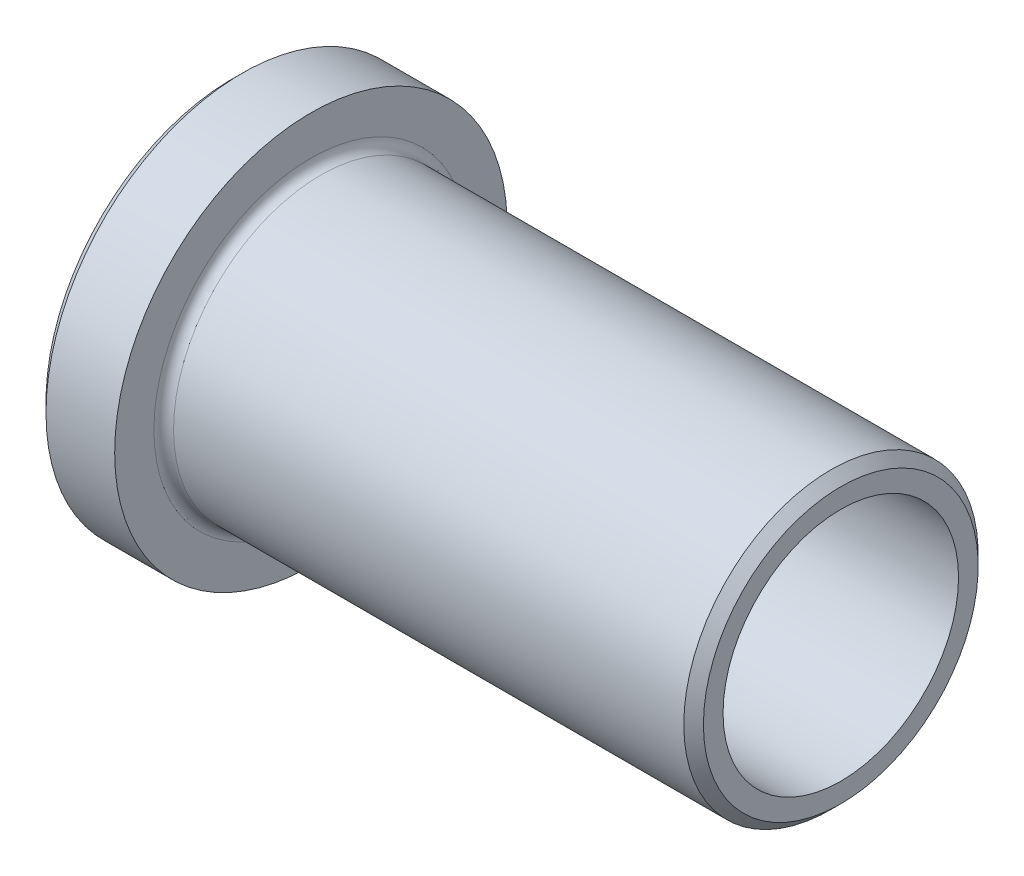
ISO-10303-21;
HEADER;
FILE_DESCRIPTION(('STEP AP214'),'2;1');
FILE_NAME('part.step','',(''),(''),'','','');
FILE_SCHEMA(('AUTOMOTIVE_DESIGN { 1 0 10303 214 1 1 1 1 }'));
ENDSEC;
DATA;
#1=APPLICATION_CONTEXT('core data for automotive mechanical design processes');
#2=APPLICATION_PROTOCOL_DEFINITION('international standard','automotive_design',2000,#1);
#3=PRODUCT_CONTEXT('',#1,'mechanical');
#4=PRODUCT('Part','Part','',(#3));
#5=PRODUCT_RELATED_PRODUCT_CATEGORY('part','',(#4));
#6=PRODUCT_DEFINITION_FORMATION('','',#4);
#7=PRODUCT_DEFINITION_CONTEXT('part definition',#1,'design');
#8=PRODUCT_DEFINITION('design','',#6,#7);
#9=PRODUCT_DEFINITION_SHAPE('','',#8);
#10=(LENGTH_UNIT() NAMED_UNIT(*) SI_UNIT(.MILLI.,.METRE.));
#11=(NAMED_UNIT(*) PLANE_ANGLE_UNIT() SI_UNIT($,.RADIAN.));
#12=(NAMED_UNIT(*) SI_UNIT($,.STERADIAN.) SOLID_ANGLE_UNIT());
#13=UNCERTAINTY_MEASURE_WITH_UNIT(LENGTH_MEASURE(1.E-05),#10,'distance_accuracy_value','');
#14=(GEOMETRIC_REPRESENTATION_CONTEXT(3) GLOBAL_UNCERTAINTY_ASSIGNED_CONTEXT((#13)) GLOBAL_UNIT_ASSIGNED_CONTEXT((#10,
#11,#12)) REPRESENTATION_CONTEXT('',''));
#15=CARTESIAN_POINT('',(0.,0.,0.));
#16=DIRECTION('',(0.,0.,1.));
#17=DIRECTION('',(1.,0.,0.));
#18=AXIS2_PLACEMENT_3D('',#15,#16,#17);
#19=CARTESIAN_POINT('',(-6.11439842209073,0.,0.));
#20=DIRECTION('',(-1.,0.,0.));
#21=DIRECTION('',(0.,0.,1.));
#22=AXIS2_PLACEMENT_3D('',#19,#20,#21);
#23=CYLINDRICAL_SURFACE('',#22,6.);
#24=CARTESIAN_POINT('',(31.,0.,0.));
#25=DIRECTION('',(-1.,0.,0.));
#26=DIRECTION('',(0.,0.,1.));
#27=AXIS2_PLACEMENT_3D('',#24,#25,#26);
#28=CIRCLE('',#27,6.);
#29=CARTESIAN_POINT('',(31.,0.,6.));
#30=VERTEX_POINT('',#29);
#31=EDGE_CURVE('E75',#30,#30,#28,.T.);
#32=ORIENTED_EDGE('',*,*,#31,.F.);
#33=EDGE_LOOP('',(#32));
#34=FACE_BOUND('',#33,.T.);
#35=CARTESIAN_POINT('',(0.,0.,0.));
#36=DIRECTION('',(-1.,0.,0.));
#37=DIRECTION('',(0.,0.,1.));
#38=AXIS2_PLACEMENT_3D('',#35,#36,#37);
#39=CIRCLE('',#38,6.);
#40=CARTESIAN_POINT('',(0.,0.,6.));
#41=VERTEX_POINT('',#40);
#42=EDGE_CURVE('E67',#41,#41,#39,.T.);
#43=ORIENTED_EDGE('',*,*,#42,.T.);
#44=EDGE_LOOP('',(#43));
#45=FACE_BOUND('',#44,.T.);
#46=ADVANCED_FACE('F39',(#34,#45),#23,.F.);
#47=CARTESIAN_POINT('',(0.,6.,0.));
#48=DIRECTION('',(1.,0.,0.));
#49=DIRECTION('',(0.,0.,-1.));
#50=AXIS2_PLACEMENT_3D('',#47,#48,#49);
#51=PLANE('',#50);
#52=CARTESIAN_POINT('',(0.,0.,0.));
#53=DIRECTION('',(1.,0.,0.));
#54=DIRECTION('',(0.,0.,-1.));
#55=AXIS2_PLACEMENT_3D('',#52,#53,#54);
#56=CIRCLE('',#55,9.50000000000001);
#57=CARTESIAN_POINT('',(0.,0.,-9.50000000000001));
#58=VERTEX_POINT('',#57);
#59=EDGE_CURVE('E50',#58,#58,#56,.F.);
#60=ORIENTED_EDGE('',*,*,#59,.T.);
#61=EDGE_LOOP('',(#60));
#62=FACE_BOUND('',#61,.T.);
#63=ORIENTED_EDGE('',*,*,#42,.F.);
#64=EDGE_LOOP('',(#63));
#65=FACE_BOUND('',#64,.T.);
#66=ADVANCED_FACE('F78',(#62,#65),#51,.F.);
#67=CARTESIAN_POINT('',(-6.11439842209073,0.,0.));
#68=DIRECTION('',(-1.,0.,0.));
#69=DIRECTION('',(0.,0.,1.));
#70=AXIS2_PLACEMENT_3D('',#67,#68,#69);
#71=CYLINDRICAL_SURFACE('',#70,10.);
#72=CARTESIAN_POINT('',(0.499999999999999,0.,0.));
#73=DIRECTION('',(1.,0.,0.));
#74=DIRECTION('',(0.,0.,-1.));
#75=AXIS2_PLACEMENT_3D('',#72,#73,#74);
#76=CIRCLE('',#75,10.);
#77=CARTESIAN_POINT('',(0.499999999999999,0.,-10.));
#78=VERTEX_POINT('',#77);
#79=EDGE_CURVE('E10',#78,#78,#76,.T.);
#80=ORIENTED_EDGE('',*,*,#79,.T.);
#81=EDGE_LOOP('',(#80));
#82=FACE_BOUND('',#81,.T.);
#83=CARTESIAN_POINT('',(4.,0.,0.));
#84=DIRECTION('',(-1.,0.,0.));
#85=DIRECTION('',(0.,0.,1.));
#86=AXIS2_PLACEMENT_3D('',#83,#84,#85);
#87=CIRCLE('',#86,10.);
#88=CARTESIAN_POINT('',(4.,0.,10.));
#89=VERTEX_POINT('',#88);
#90=EDGE_CURVE('E66',#89,#89,#87,.T.);
#91=ORIENTED_EDGE('',*,*,#90,.T.);
#92=EDGE_LOOP('',(#91));
#93=FACE_BOUND('',#92,.T.);
#94=ADVANCED_FACE('F83',(#82,#93),#71,.T.);
#95=CARTESIAN_POINT('',(4.,10.,0.));
#96=DIRECTION('',(-1.,0.,0.));
#97=DIRECTION('',(0.,0.,1.));
#98=AXIS2_PLACEMENT_3D('',#95,#96,#97);
#99=PLANE('',#98);
#100=CARTESIAN_POINT('',(4.,0.,0.));
#101=DIRECTION('',(-1.,0.,0.));
#102=DIRECTION('',(0.,0.,1.));
#103=AXIS2_PLACEMENT_3D('',#100,#101,#102);
#104=CIRCLE('',#103,8.);
#105=CARTESIAN_POINT('',(4.,0.,8.));
#106=VERTEX_POINT('',#105);
#107=EDGE_CURVE('E64',#106,#106,#104,.T.);
#108=ORIENTED_EDGE('',*,*,#107,.T.);
#109=EDGE_LOOP('',(#108));
#110=FACE_BOUND('',#109,.T.);
#111=ORIENTED_EDGE('',*,*,#90,.F.);
#112=EDGE_LOOP('',(#111));
#113=FACE_BOUND('',#112,.T.);
#114=ADVANCED_FACE('F93',(#110,#113),#99,.F.);
#115=CARTESIAN_POINT('',(-6.11439842209073,0.,0.));
#116=DIRECTION('',(-1.,0.,0.));
#117=DIRECTION('',(0.,0.,1.));
#118=AXIS2_PLACEMENT_3D('',#115,#116,#117);
#119=CYLINDRICAL_SURFACE('',#118,7.5);
#120=CARTESIAN_POINT('',(30.5,0.,0.));
#121=DIRECTION('',(-1.,0.,0.));
#122=DIRECTION('',(0.,0.,1.));
#123=AXIS2_PLACEMENT_3D('',#120,#121,#122);
#124=CIRCLE('',#123,7.5);
#125=CARTESIAN_POINT('',(30.5,0.,7.5));
#126=VERTEX_POINT('',#125);
#127=EDGE_CURVE('E54',#126,#126,#124,.T.);
#128=ORIENTED_EDGE('',*,*,#127,.T.);
#129=EDGE_LOOP('',(#128));
#130=FACE_BOUND('',#129,.T.);
#131=CARTESIAN_POINT('',(4.5,0.,0.));
#132=DIRECTION('',(-1.,0.,0.));
#133=DIRECTION('',(0.,0.,1.));
#134=AXIS2_PLACEMENT_3D('',#131,#132,#133);
#135=CIRCLE('',#134,7.5);
#136=CARTESIAN_POINT('',(4.5,0.,7.5));
#137=VERTEX_POINT('',#136);
#138=EDGE_CURVE('E58',#137,#137,#135,.F.);
#139=ORIENTED_EDGE('',*,*,#138,.T.);
#140=EDGE_LOOP('',(#139));
#141=FACE_BOUND('',#140,.T.);
#142=ADVANCED_FACE('F115',(#130,#141),#119,.T.);
#143=CARTESIAN_POINT('',(31.,7.5,0.));
#144=DIRECTION('',(-1.,0.,0.));
#145=DIRECTION('',(0.,0.,1.));
#146=AXIS2_PLACEMENT_3D('',#143,#144,#145);
#147=PLANE('',#146);
#148=CARTESIAN_POINT('',(31.,0.,0.));
#149=DIRECTION('',(-1.,0.,0.));
#150=DIRECTION('',(0.,0.,1.));
#151=AXIS2_PLACEMENT_3D('',#148,#149,#150);
#152=CIRCLE('',#151,7.);
#153=CARTESIAN_POINT('',(31.,0.,7.));
#154=VERTEX_POINT('',#153);
#155=EDGE_CURVE('E51',#154,#154,#152,.F.);
#156=ORIENTED_EDGE('',*,*,#155,.T.);
#157=EDGE_LOOP('',(#156));
#158=FACE_BOUND('',#157,.T.);
#159=ORIENTED_EDGE('',*,*,#31,.T.);
#160=EDGE_LOOP('',(#159));
#161=FACE_BOUND('',#160,.T.);
#162=ADVANCED_FACE('F77',(#158,#161),#147,.F.);
#163=CARTESIAN_POINT('',(4.5,0.,0.));
#164=DIRECTION('',(-1.,0.,0.));
#165=DIRECTION('',(0.,0.,1.));
#166=AXIS2_PLACEMENT_3D('',#163,#164,#165);
#167=TOROIDAL_SURFACE('',#166,8.,0.5);
#168=ORIENTED_EDGE('',*,*,#138,.F.);
#169=EDGE_LOOP('',(#168));
#170=FACE_BOUND('',#169,.T.);
#171=ORIENTED_EDGE('',*,*,#107,.F.);
#172=EDGE_LOOP('',(#171));
#173=FACE_BOUND('',#172,.T.);
#174=ADVANCED_FACE('F92',(#170,#173),#167,.F.);
#175=CARTESIAN_POINT('',(30.5,0.,0.));
#176=DIRECTION('',(-1.,0.,0.));
#177=DIRECTION('',(0.,0.,1.));
#178=AXIS2_PLACEMENT_3D('',#175,#176,#177);
#179=CONICAL_SURFACE('',#178,7.5,0.785398163397452);
#180=ORIENTED_EDGE('',*,*,#155,.F.);
#181=EDGE_LOOP('',(#180));
#182=FACE_BOUND('',#181,.T.);
#183=ORIENTED_EDGE('',*,*,#127,.F.);
#184=EDGE_LOOP('',(#183));
#185=FACE_BOUND('',#184,.T.);
#186=ADVANCED_FACE('F96',(#182,#185),#179,.T.);
#187=CARTESIAN_POINT('',(0.,0.,0.));
#188=DIRECTION('',(1.,0.,0.));
#189=DIRECTION('',(0.,0.,-1.));
#190=AXIS2_PLACEMENT_3D('',#187,#188,#189);
#191=CONICAL_SURFACE('',#190,9.50000000000001,0.785398163397445);
#192=ORIENTED_EDGE('',*,*,#79,.F.);
#193=EDGE_LOOP('',(#192));
#194=FACE_BOUND('',#193,.T.);
#195=ORIENTED_EDGE('',*,*,#59,.F.);
#196=EDGE_LOOP('',(#195));
#197=FACE_BOUND('',#196,.T.);
#198=ADVANCED_FACE('F45',(#194,#197),#191,.T.);
#199=CLOSED_SHELL('',(#46,#66,#94,#114,#142,#162,#174,#186,#198));
#200=MANIFOLD_SOLID_BREP('B2',#199);
#201=ADVANCED_BREP_SHAPE_REPRESENTATION('',(#18,#200),#14);
#202=SHAPE_DEFINITION_REPRESENTATION(#9,#201);
ENDSEC;
END-ISO-10303-21;
